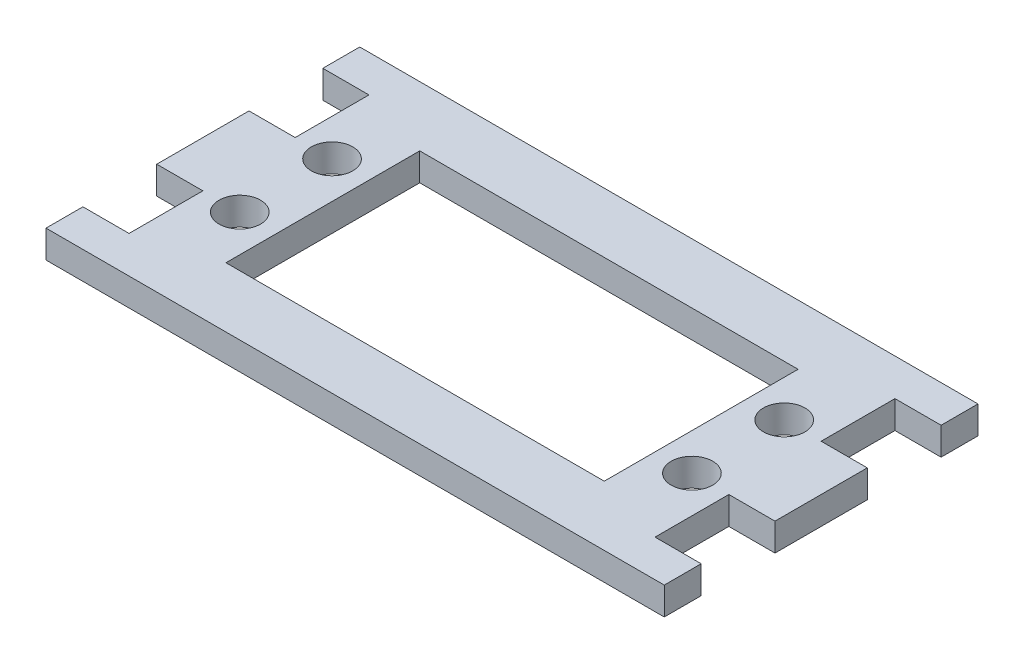
ISO-10303-21;
HEADER;
FILE_DESCRIPTION(('STEP AP214'),'2;1');
FILE_NAME('part.step','',(''),(''),'','','');
FILE_SCHEMA(('AUTOMOTIVE_DESIGN { 1 0 10303 214 1 1 1 1 }'));
ENDSEC;
DATA;
#1=APPLICATION_CONTEXT('core data for automotive mechanical design processes');
#2=APPLICATION_PROTOCOL_DEFINITION('international standard','automotive_design',2000,#1);
#3=PRODUCT_CONTEXT('',#1,'mechanical');
#4=PRODUCT('Part','Part','',(#3));
#5=PRODUCT_RELATED_PRODUCT_CATEGORY('part','',(#4));
#6=PRODUCT_DEFINITION_FORMATION('','',#4);
#7=PRODUCT_DEFINITION_CONTEXT('part definition',#1,'design');
#8=PRODUCT_DEFINITION('design','',#6,#7);
#9=PRODUCT_DEFINITION_SHAPE('','',#8);
#10=(LENGTH_UNIT() NAMED_UNIT(*) SI_UNIT(.MILLI.,.METRE.));
#11=(NAMED_UNIT(*) PLANE_ANGLE_UNIT() SI_UNIT($,.RADIAN.));
#12=(NAMED_UNIT(*) SI_UNIT($,.STERADIAN.) SOLID_ANGLE_UNIT());
#13=UNCERTAINTY_MEASURE_WITH_UNIT(LENGTH_MEASURE(1.E-05),#10,'distance_accuracy_value','');
#14=(GEOMETRIC_REPRESENTATION_CONTEXT(3) GLOBAL_UNCERTAINTY_ASSIGNED_CONTEXT((#13)) GLOBAL_UNIT_ASSIGNED_CONTEXT((#10,
#11,#12)) REPRESENTATION_CONTEXT('',''));
#15=CARTESIAN_POINT('',(0.,0.,0.));
#16=DIRECTION('',(0.,0.,1.));
#17=DIRECTION('',(1.,0.,0.));
#18=AXIS2_PLACEMENT_3D('',#15,#16,#17);
#19=CARTESIAN_POINT('',(0.,0.,0.));
#20=DIRECTION('',(0.,1.,0.));
#21=DIRECTION('',(0.,0.,1.));
#22=AXIS2_PLACEMENT_3D('',#19,#20,#21);
#23=PLANE('',#22);
#24=CARTESIAN_POINT('',(24.5,0.,-4.99999999999999));
#25=DIRECTION('',(0.,-1.,0.));
#26=DIRECTION('',(0.,0.,-1.));
#27=AXIS2_PLACEMENT_3D('',#24,#25,#26);
#28=CIRCLE('',#27,2.25);
#29=CARTESIAN_POINT('',(24.5,0.,-7.24999999999999));
#30=VERTEX_POINT('',#29);
#31=EDGE_CURVE('E214',#30,#30,#28,.F.);
#32=ORIENTED_EDGE('',*,*,#31,.T.);
#33=EDGE_LOOP('',(#32));
#34=FACE_BOUND('',#33,.T.);
#35=CARTESIAN_POINT('',(-24.5,0.,5.00000000000001));
#36=DIRECTION('',(0.,-1.,0.));
#37=DIRECTION('',(0.,0.,-1.));
#38=AXIS2_PLACEMENT_3D('',#35,#36,#37);
#39=CIRCLE('',#38,2.25);
#40=CARTESIAN_POINT('',(-24.5,0.,2.75000000000001));
#41=VERTEX_POINT('',#40);
#42=EDGE_CURVE('E217',#41,#41,#39,.F.);
#43=ORIENTED_EDGE('',*,*,#42,.T.);
#44=EDGE_LOOP('',(#43));
#45=FACE_BOUND('',#44,.T.);
#46=DIRECTION('',(1.,0.,0.));
#47=VECTOR('',#46,1.);
#48=CARTESIAN_POINT('',(-20.5,0.,-10.5));
#49=LINE('',#48,#47);
#50=CARTESIAN_POINT('',(-20.5,0.,-10.5));
#51=VERTEX_POINT('',#50);
#52=CARTESIAN_POINT('',(20.5,0.,-10.5));
#53=VERTEX_POINT('',#52);
#54=EDGE_CURVE('E574',#51,#53,#49,.T.);
#55=ORIENTED_EDGE('',*,*,#54,.F.);
#56=DIRECTION('',(0.,0.,-1.));
#57=VECTOR('',#56,1.);
#58=CARTESIAN_POINT('',(-20.5,0.,-10.5));
#59=LINE('',#58,#57);
#60=CARTESIAN_POINT('',(-20.5,0.,10.5));
#61=VERTEX_POINT('',#60);
#62=EDGE_CURVE('E560',#61,#51,#59,.T.);
#63=ORIENTED_EDGE('',*,*,#62,.F.);
#64=DIRECTION('',(-1.,0.,0.));
#65=VECTOR('',#64,1.);
#66=CARTESIAN_POINT('',(-20.5,0.,10.5));
#67=LINE('',#66,#65);
#68=CARTESIAN_POINT('',(20.5,0.,10.5));
#69=VERTEX_POINT('',#68);
#70=EDGE_CURVE('E566',#69,#61,#67,.T.);
#71=ORIENTED_EDGE('',*,*,#70,.F.);
#72=DIRECTION('',(0.,0.,1.));
#73=VECTOR('',#72,1.);
#74=CARTESIAN_POINT('',(20.5,0.,-10.5));
#75=LINE('',#74,#73);
#76=EDGE_CURVE('E571',#53,#69,#75,.T.);
#77=ORIENTED_EDGE('',*,*,#76,.F.);
#78=EDGE_LOOP('',(#55,#63,#71,#77));
#79=FACE_BOUND('',#78,.T.);
#80=DIRECTION('',(-1.,0.,0.));
#81=VECTOR('',#80,1.);
#82=CARTESIAN_POINT('',(-27.,0.,17.));
#83=LINE('',#82,#81);
#84=CARTESIAN_POINT('',(33.5,0.,17.));
#85=VERTEX_POINT('',#84);
#86=CARTESIAN_POINT('',(-33.5,0.,17.));
#87=VERTEX_POINT('',#86);
#88=EDGE_CURVE('E180',#85,#87,#83,.T.);
#89=ORIENTED_EDGE('',*,*,#88,.T.);
#90=DIRECTION('',(0.,0.,-1.));
#91=VECTOR('',#90,1.);
#92=CARTESIAN_POINT('',(-33.5,0.,17.));
#93=LINE('',#92,#91);
#94=CARTESIAN_POINT('',(-33.5,0.,13.));
#95=VERTEX_POINT('',#94);
#96=EDGE_CURVE('E577',#87,#95,#93,.T.);
#97=ORIENTED_EDGE('',*,*,#96,.T.);
#98=DIRECTION('',(1.,0.,0.));
#99=VECTOR('',#98,1.);
#100=CARTESIAN_POINT('',(-33.5,0.,13.));
#101=LINE('',#100,#99);
#102=CARTESIAN_POINT('',(-28.5,0.,13.));
#103=VERTEX_POINT('',#102);
#104=EDGE_CURVE('E582',#95,#103,#101,.T.);
#105=ORIENTED_EDGE('',*,*,#104,.T.);
#106=DIRECTION('',(0.,0.,-1.));
#107=VECTOR('',#106,1.);
#108=CARTESIAN_POINT('',(-28.5,0.,5.));
#109=LINE('',#108,#107);
#110=CARTESIAN_POINT('',(-28.5,0.,5.));
#111=VERTEX_POINT('',#110);
#112=EDGE_CURVE('E587',#103,#111,#109,.T.);
#113=ORIENTED_EDGE('',*,*,#112,.T.);
#114=DIRECTION('',(-1.,0.,0.));
#115=VECTOR('',#114,1.);
#116=CARTESIAN_POINT('',(-33.5,0.,5.));
#117=LINE('',#116,#115);
#118=CARTESIAN_POINT('',(-33.5,0.,5.));
#119=VERTEX_POINT('',#118);
#120=EDGE_CURVE('E592',#111,#119,#117,.T.);
#121=ORIENTED_EDGE('',*,*,#120,.T.);
#122=DIRECTION('',(0.,0.,-1.));
#123=VECTOR('',#122,1.);
#124=CARTESIAN_POINT('',(-33.5,0.,0.));
#125=LINE('',#124,#123);
#126=CARTESIAN_POINT('',(-33.5,0.,-5.));
#127=VERTEX_POINT('',#126);
#128=EDGE_CURVE('E597',#119,#127,#125,.T.);
#129=ORIENTED_EDGE('',*,*,#128,.T.);
#130=DIRECTION('',(1.,0.,0.));
#131=VECTOR('',#130,1.);
#132=CARTESIAN_POINT('',(-33.5,0.,-5.));
#133=LINE('',#132,#131);
#134=CARTESIAN_POINT('',(-28.5,0.,-5.));
#135=VERTEX_POINT('',#134);
#136=EDGE_CURVE('E602',#127,#135,#133,.T.);
#137=ORIENTED_EDGE('',*,*,#136,.T.);
#138=DIRECTION('',(0.,0.,-1.));
#139=VECTOR('',#138,1.);
#140=CARTESIAN_POINT('',(-28.5,0.,-5.));
#141=LINE('',#140,#139);
#142=CARTESIAN_POINT('',(-28.5,0.,-13.));
#143=VERTEX_POINT('',#142);
#144=EDGE_CURVE('E607',#135,#143,#141,.T.);
#145=ORIENTED_EDGE('',*,*,#144,.T.);
#146=DIRECTION('',(-1.,0.,0.));
#147=VECTOR('',#146,1.);
#148=CARTESIAN_POINT('',(-33.5,0.,-13.));
#149=LINE('',#148,#147);
#150=CARTESIAN_POINT('',(-33.5,0.,-13.));
#151=VERTEX_POINT('',#150);
#152=EDGE_CURVE('E612',#143,#151,#149,.T.);
#153=ORIENTED_EDGE('',*,*,#152,.T.);
#154=DIRECTION('',(0.,0.,-1.));
#155=VECTOR('',#154,1.);
#156=CARTESIAN_POINT('',(-33.5,0.,-17.));
#157=LINE('',#156,#155);
#158=CARTESIAN_POINT('',(-33.5,0.,-17.));
#159=VERTEX_POINT('',#158);
#160=EDGE_CURVE('E617',#151,#159,#157,.T.);
#161=ORIENTED_EDGE('',*,*,#160,.T.);
#162=DIRECTION('',(1.,0.,0.));
#163=VECTOR('',#162,1.);
#164=CARTESIAN_POINT('',(-28.5,0.,-17.));
#165=LINE('',#164,#163);
#166=CARTESIAN_POINT('',(33.5,0.,-17.));
#167=VERTEX_POINT('',#166);
#168=EDGE_CURVE('E622',#159,#167,#165,.T.);
#169=ORIENTED_EDGE('',*,*,#168,.T.);
#170=DIRECTION('',(0.,0.,1.));
#171=VECTOR('',#170,1.);
#172=CARTESIAN_POINT('',(33.5,0.,-17.));
#173=LINE('',#172,#171);
#174=CARTESIAN_POINT('',(33.5,0.,-13.));
#175=VERTEX_POINT('',#174);
#176=EDGE_CURVE('E627',#167,#175,#173,.T.);
#177=ORIENTED_EDGE('',*,*,#176,.T.);
#178=DIRECTION('',(-1.,0.,0.));
#179=VECTOR('',#178,1.);
#180=CARTESIAN_POINT('',(33.5,0.,-13.));
#181=LINE('',#180,#179);
#182=CARTESIAN_POINT('',(28.5,0.,-13.));
#183=VERTEX_POINT('',#182);
#184=EDGE_CURVE('E632',#175,#183,#181,.T.);
#185=ORIENTED_EDGE('',*,*,#184,.T.);
#186=DIRECTION('',(0.,0.,1.));
#187=VECTOR('',#186,1.);
#188=CARTESIAN_POINT('',(28.5,0.,-5.));
#189=LINE('',#188,#187);
#190=CARTESIAN_POINT('',(28.5,0.,-5.));
#191=VERTEX_POINT('',#190);
#192=EDGE_CURVE('E637',#183,#191,#189,.T.);
#193=ORIENTED_EDGE('',*,*,#192,.T.);
#194=DIRECTION('',(1.,0.,0.));
#195=VECTOR('',#194,1.);
#196=CARTESIAN_POINT('',(33.5,0.,-5.));
#197=LINE('',#196,#195);
#198=CARTESIAN_POINT('',(33.5,0.,-5.));
#199=VERTEX_POINT('',#198);
#200=EDGE_CURVE('E642',#191,#199,#197,.T.);
#201=ORIENTED_EDGE('',*,*,#200,.T.);
#202=DIRECTION('',(0.,0.,1.));
#203=VECTOR('',#202,1.);
#204=CARTESIAN_POINT('',(33.5,0.,0.));
#205=LINE('',#204,#203);
#206=CARTESIAN_POINT('',(33.5,0.,5.));
#207=VERTEX_POINT('',#206);
#208=EDGE_CURVE('E647',#199,#207,#205,.T.);
#209=ORIENTED_EDGE('',*,*,#208,.T.);
#210=DIRECTION('',(-1.,0.,0.));
#211=VECTOR('',#210,1.);
#212=CARTESIAN_POINT('',(33.5,0.,5.));
#213=LINE('',#212,#211);
#214=CARTESIAN_POINT('',(28.5,0.,5.));
#215=VERTEX_POINT('',#214);
#216=EDGE_CURVE('E652',#207,#215,#213,.T.);
#217=ORIENTED_EDGE('',*,*,#216,.T.);
#218=DIRECTION('',(0.,0.,1.));
#219=VECTOR('',#218,1.);
#220=CARTESIAN_POINT('',(28.5,0.,5.));
#221=LINE('',#220,#219);
#222=CARTESIAN_POINT('',(28.5,0.,13.));
#223=VERTEX_POINT('',#222);
#224=EDGE_CURVE('E538',#215,#223,#221,.T.);
#225=ORIENTED_EDGE('',*,*,#224,.T.);
#226=DIRECTION('',(1.,0.,0.));
#227=VECTOR('',#226,1.);
#228=CARTESIAN_POINT('',(33.5,0.,13.));
#229=LINE('',#228,#227);
#230=CARTESIAN_POINT('',(33.5,0.,13.));
#231=VERTEX_POINT('',#230);
#232=EDGE_CURVE('E193',#223,#231,#229,.T.);
#233=ORIENTED_EDGE('',*,*,#232,.T.);
#234=DIRECTION('',(0.,0.,1.));
#235=VECTOR('',#234,1.);
#236=CARTESIAN_POINT('',(33.5,0.,17.));
#237=LINE('',#236,#235);
#238=EDGE_CURVE('E175',#231,#85,#237,.T.);
#239=ORIENTED_EDGE('',*,*,#238,.T.);
#240=EDGE_LOOP('',(#89,#97,#105,#113,#121,#129,#137,#145,#153,#161,#169,#177,#185,#193,#201,
#209,#217,#225,#233,#239));
#241=FACE_BOUND('',#240,.T.);
#242=CARTESIAN_POINT('',(-24.5,0.,-4.99999999999999));
#243=DIRECTION('',(0.,-1.,0.));
#244=DIRECTION('',(0.,0.,-1.));
#245=AXIS2_PLACEMENT_3D('',#242,#243,#244);
#246=CIRCLE('',#245,2.25);
#247=CARTESIAN_POINT('',(-24.5,0.,-7.24999999999999));
#248=VERTEX_POINT('',#247);
#249=EDGE_CURVE('E189',#248,#248,#246,.F.);
#250=ORIENTED_EDGE('',*,*,#249,.T.);
#251=EDGE_LOOP('',(#250));
#252=FACE_BOUND('',#251,.T.);
#253=CARTESIAN_POINT('',(24.5,0.,5.00000000000001));
#254=DIRECTION('',(0.,-1.,0.));
#255=DIRECTION('',(0.,0.,-1.));
#256=AXIS2_PLACEMENT_3D('',#253,#254,#255);
#257=CIRCLE('',#256,2.25);
#258=CARTESIAN_POINT('',(24.5,0.,2.75000000000001));
#259=VERTEX_POINT('',#258);
#260=EDGE_CURVE('E19',#259,#259,#257,.F.);
#261=ORIENTED_EDGE('',*,*,#260,.T.);
#262=EDGE_LOOP('',(#261));
#263=FACE_BOUND('',#262,.T.);
#264=ADVANCED_FACE('F16',(#34,#45,#79,#241,#252,#263),#23,.F.);
#265=CARTESIAN_POINT('',(24.5,3.,5.00000000000001));
#266=DIRECTION('',(0.,-1.,0.));
#267=DIRECTION('',(0.,0.,-1.));
#268=AXIS2_PLACEMENT_3D('',#265,#266,#267);
#269=CYLINDRICAL_SURFACE('',#268,2.25);
#270=CARTESIAN_POINT('',(24.5,3.,5.00000000000001));
#271=DIRECTION('',(0.,-1.,0.));
#272=DIRECTION('',(0.,0.,-1.));
#273=AXIS2_PLACEMENT_3D('',#270,#271,#272);
#274=CIRCLE('',#273,2.25);
#275=CARTESIAN_POINT('',(24.5,3.,2.75000000000001));
#276=VERTEX_POINT('',#275);
#277=EDGE_CURVE('E211',#276,#276,#274,.T.);
#278=ORIENTED_EDGE('',*,*,#277,.F.);
#279=EDGE_LOOP('',(#278));
#280=FACE_BOUND('',#279,.T.);
#281=ORIENTED_EDGE('',*,*,#260,.F.);
#282=EDGE_LOOP('',(#281));
#283=FACE_BOUND('',#282,.T.);
#284=ADVANCED_FACE('F225',(#280,#283),#269,.F.);
#285=CARTESIAN_POINT('',(-24.5,3.,-4.99999999999999));
#286=DIRECTION('',(0.,-1.,0.));
#287=DIRECTION('',(0.,0.,-1.));
#288=AXIS2_PLACEMENT_3D('',#285,#286,#287);
#289=CYLINDRICAL_SURFACE('',#288,2.25);
#290=CARTESIAN_POINT('',(-24.5,3.,-4.99999999999999));
#291=DIRECTION('',(0.,-1.,0.));
#292=DIRECTION('',(0.,0.,-1.));
#293=AXIS2_PLACEMENT_3D('',#290,#291,#292);
#294=CIRCLE('',#293,2.25);
#295=CARTESIAN_POINT('',(-24.5,3.,-7.24999999999999));
#296=VERTEX_POINT('',#295);
#297=EDGE_CURVE('E207',#296,#296,#294,.T.);
#298=ORIENTED_EDGE('',*,*,#297,.F.);
#299=EDGE_LOOP('',(#298));
#300=FACE_BOUND('',#299,.T.);
#301=ORIENTED_EDGE('',*,*,#249,.F.);
#302=EDGE_LOOP('',(#301));
#303=FACE_BOUND('',#302,.T.);
#304=ADVANCED_FACE('F227',(#300,#303),#289,.F.);
#305=CARTESIAN_POINT('',(-27.,3.,17.));
#306=DIRECTION('',(0.,0.,-1.));
#307=DIRECTION('',(-1.,0.,0.));
#308=AXIS2_PLACEMENT_3D('',#305,#306,#307);
#309=PLANE('',#308);
#310=DIRECTION('',(0.,1.,0.));
#311=VECTOR('',#310,1.);
#312=CARTESIAN_POINT('',(33.5,3.,17.));
#313=LINE('',#312,#311);
#314=CARTESIAN_POINT('',(33.5,3.,17.));
#315=VERTEX_POINT('',#314);
#316=EDGE_CURVE('E182',#85,#315,#313,.T.);
#317=ORIENTED_EDGE('',*,*,#316,.T.);
#318=DIRECTION('',(1.,0.,0.));
#319=VECTOR('',#318,1.);
#320=CARTESIAN_POINT('',(0.,3.,17.));
#321=LINE('',#320,#319);
#322=CARTESIAN_POINT('',(-33.5,3.,17.));
#323=VERTEX_POINT('',#322);
#324=EDGE_CURVE('E210',#323,#315,#321,.T.);
#325=ORIENTED_EDGE('',*,*,#324,.F.);
#326=DIRECTION('',(0.,1.,0.));
#327=VECTOR('',#326,1.);
#328=CARTESIAN_POINT('',(-33.5,3.,17.));
#329=LINE('',#328,#327);
#330=EDGE_CURVE('E185',#323,#87,#329,.F.);
#331=ORIENTED_EDGE('',*,*,#330,.T.);
#332=ORIENTED_EDGE('',*,*,#88,.F.);
#333=EDGE_LOOP('',(#317,#325,#331,#332));
#334=FACE_BOUND('',#333,.T.);
#335=ADVANCED_FACE('F181',(#334),#309,.F.);
#336=CARTESIAN_POINT('',(33.5,3.,17.));
#337=DIRECTION('',(-1.,0.,0.));
#338=DIRECTION('',(0.,0.,1.));
#339=AXIS2_PLACEMENT_3D('',#336,#337,#338);
#340=PLANE('',#339);
#341=DIRECTION('',(0.,1.,0.));
#342=VECTOR('',#341,1.);
#343=CARTESIAN_POINT('',(33.5,3.,13.));
#344=LINE('',#343,#342);
#345=CARTESIAN_POINT('',(33.5,3.,13.));
#346=VERTEX_POINT('',#345);
#347=EDGE_CURVE('E195',#231,#346,#344,.T.);
#348=ORIENTED_EDGE('',*,*,#347,.T.);
#349=DIRECTION('',(0.,0.,1.));
#350=VECTOR('',#349,1.);
#351=CARTESIAN_POINT('',(33.5,3.,0.));
#352=LINE('',#351,#350);
#353=EDGE_CURVE('E199',#315,#346,#352,.F.);
#354=ORIENTED_EDGE('',*,*,#353,.F.);
#355=ORIENTED_EDGE('',*,*,#316,.F.);
#356=ORIENTED_EDGE('',*,*,#238,.F.);
#357=EDGE_LOOP('',(#348,#354,#355,#356));
#358=FACE_BOUND('',#357,.T.);
#359=ADVANCED_FACE('F197',(#358),#340,.F.);
#360=CARTESIAN_POINT('',(33.5,3.,13.));
#361=DIRECTION('',(0.,0.,1.));
#362=DIRECTION('',(1.,0.,0.));
#363=AXIS2_PLACEMENT_3D('',#360,#361,#362);
#364=PLANE('',#363);
#365=DIRECTION('',(0.,1.,0.));
#366=VECTOR('',#365,1.);
#367=CARTESIAN_POINT('',(28.5,3.,13.));
#368=LINE('',#367,#366);
#369=CARTESIAN_POINT('',(28.5,3.,13.));
#370=VERTEX_POINT('',#369);
#371=EDGE_CURVE('E534',#223,#370,#368,.T.);
#372=ORIENTED_EDGE('',*,*,#371,.T.);
#373=DIRECTION('',(1.,0.,0.));
#374=VECTOR('',#373,1.);
#375=CARTESIAN_POINT('',(0.,3.,13.));
#376=LINE('',#375,#374);
#377=EDGE_CURVE('E537',#346,#370,#376,.F.);
#378=ORIENTED_EDGE('',*,*,#377,.F.);
#379=ORIENTED_EDGE('',*,*,#347,.F.);
#380=ORIENTED_EDGE('',*,*,#232,.F.);
#381=EDGE_LOOP('',(#372,#378,#379,#380));
#382=FACE_BOUND('',#381,.T.);
#383=ADVANCED_FACE('F336',(#382),#364,.F.);
#384=CARTESIAN_POINT('',(28.5,3.,5.));
#385=DIRECTION('',(-1.,0.,0.));
#386=DIRECTION('',(0.,0.,1.));
#387=AXIS2_PLACEMENT_3D('',#384,#385,#386);
#388=PLANE('',#387);
#389=DIRECTION('',(0.,1.,0.));
#390=VECTOR('',#389,1.);
#391=CARTESIAN_POINT('',(28.5,3.,5.));
#392=LINE('',#391,#390);
#393=CARTESIAN_POINT('',(28.5,3.,5.));
#394=VERTEX_POINT('',#393);
#395=EDGE_CURVE('E543',#215,#394,#392,.T.);
#396=ORIENTED_EDGE('',*,*,#395,.T.);
#397=DIRECTION('',(0.,0.,1.));
#398=VECTOR('',#397,1.);
#399=CARTESIAN_POINT('',(28.5,3.,0.));
#400=LINE('',#399,#398);
#401=EDGE_CURVE('E541',#370,#394,#400,.F.);
#402=ORIENTED_EDGE('',*,*,#401,.F.);
#403=ORIENTED_EDGE('',*,*,#371,.F.);
#404=ORIENTED_EDGE('',*,*,#224,.F.);
#405=EDGE_LOOP('',(#396,#402,#403,#404));
#406=FACE_BOUND('',#405,.T.);
#407=ADVANCED_FACE('F332',(#406),#388,.F.);
#408=CARTESIAN_POINT('',(33.5,3.,5.));
#409=DIRECTION('',(0.,0.,-1.));
#410=DIRECTION('',(-1.,0.,0.));
#411=AXIS2_PLACEMENT_3D('',#408,#409,#410);
#412=PLANE('',#411);
#413=DIRECTION('',(0.,1.,0.));
#414=VECTOR('',#413,1.);
#415=CARTESIAN_POINT('',(33.5,3.,5.));
#416=LINE('',#415,#414);
#417=CARTESIAN_POINT('',(33.5,3.,5.));
#418=VERTEX_POINT('',#417);
#419=EDGE_CURVE('E650',#207,#418,#416,.T.);
#420=ORIENTED_EDGE('',*,*,#419,.T.);
#421=DIRECTION('',(1.,0.,0.));
#422=VECTOR('',#421,1.);
#423=CARTESIAN_POINT('',(0.,3.,5.));
#424=LINE('',#423,#422);
#425=EDGE_CURVE('E547',#394,#418,#424,.T.);
#426=ORIENTED_EDGE('',*,*,#425,.F.);
#427=ORIENTED_EDGE('',*,*,#395,.F.);
#428=ORIENTED_EDGE('',*,*,#216,.F.);
#429=EDGE_LOOP('',(#420,#426,#427,#428));
#430=FACE_BOUND('',#429,.T.);
#431=ADVANCED_FACE('F328',(#430),#412,.F.);
#432=CARTESIAN_POINT('',(33.5,3.,0.));
#433=DIRECTION('',(-1.,0.,0.));
#434=DIRECTION('',(0.,0.,1.));
#435=AXIS2_PLACEMENT_3D('',#432,#433,#434);
#436=PLANE('',#435);
#437=DIRECTION('',(0.,1.,0.));
#438=VECTOR('',#437,1.);
#439=CARTESIAN_POINT('',(33.5,3.,-5.));
#440=LINE('',#439,#438);
#441=CARTESIAN_POINT('',(33.5,3.,-5.));
#442=VERTEX_POINT('',#441);
#443=EDGE_CURVE('E645',#199,#442,#440,.T.);
#444=ORIENTED_EDGE('',*,*,#443,.T.);
#445=DIRECTION('',(0.,0.,1.));
#446=VECTOR('',#445,1.);
#447=CARTESIAN_POINT('',(33.5,3.,0.));
#448=LINE('',#447,#446);
#449=EDGE_CURVE('E660',#418,#442,#448,.F.);
#450=ORIENTED_EDGE('',*,*,#449,.F.);
#451=ORIENTED_EDGE('',*,*,#419,.F.);
#452=ORIENTED_EDGE('',*,*,#208,.F.);
#453=EDGE_LOOP('',(#444,#450,#451,#452));
#454=FACE_BOUND('',#453,.T.);
#455=ADVANCED_FACE('F324',(#454),#436,.F.);
#456=CARTESIAN_POINT('',(33.5,3.,-5.));
#457=DIRECTION('',(0.,0.,1.));
#458=DIRECTION('',(1.,0.,0.));
#459=AXIS2_PLACEMENT_3D('',#456,#457,#458);
#460=PLANE('',#459);
#461=DIRECTION('',(0.,1.,0.));
#462=VECTOR('',#461,1.);
#463=CARTESIAN_POINT('',(28.5,3.,-5.));
#464=LINE('',#463,#462);
#465=CARTESIAN_POINT('',(28.5,3.,-5.));
#466=VERTEX_POINT('',#465);
#467=EDGE_CURVE('E640',#191,#466,#464,.T.);
#468=ORIENTED_EDGE('',*,*,#467,.T.);
#469=DIRECTION('',(1.,0.,0.));
#470=VECTOR('',#469,1.);
#471=CARTESIAN_POINT('',(0.,3.,-5.));
#472=LINE('',#471,#470);
#473=EDGE_CURVE('E661',#442,#466,#472,.F.);
#474=ORIENTED_EDGE('',*,*,#473,.F.);
#475=ORIENTED_EDGE('',*,*,#443,.F.);
#476=ORIENTED_EDGE('',*,*,#200,.F.);
#477=EDGE_LOOP('',(#468,#474,#475,#476));
#478=FACE_BOUND('',#477,.T.);
#479=ADVANCED_FACE('F320',(#478),#460,.F.);
#480=CARTESIAN_POINT('',(28.5,3.,-5.));
#481=DIRECTION('',(-1.,0.,0.));
#482=DIRECTION('',(0.,0.,1.));
#483=AXIS2_PLACEMENT_3D('',#480,#481,#482);
#484=PLANE('',#483);
#485=DIRECTION('',(0.,1.,0.));
#486=VECTOR('',#485,1.);
#487=CARTESIAN_POINT('',(28.5,3.,-13.));
#488=LINE('',#487,#486);
#489=CARTESIAN_POINT('',(28.5,3.,-13.));
#490=VERTEX_POINT('',#489);
#491=EDGE_CURVE('E635',#183,#490,#488,.T.);
#492=ORIENTED_EDGE('',*,*,#491,.T.);
#493=DIRECTION('',(0.,0.,1.));
#494=VECTOR('',#493,1.);
#495=CARTESIAN_POINT('',(28.5,3.,0.));
#496=LINE('',#495,#494);
#497=EDGE_CURVE('E666',#466,#490,#496,.F.);
#498=ORIENTED_EDGE('',*,*,#497,.F.);
#499=ORIENTED_EDGE('',*,*,#467,.F.);
#500=ORIENTED_EDGE('',*,*,#192,.F.);
#501=EDGE_LOOP('',(#492,#498,#499,#500));
#502=FACE_BOUND('',#501,.T.);
#503=ADVANCED_FACE('F316',(#502),#484,.F.);
#504=CARTESIAN_POINT('',(33.5,3.,-13.));
#505=DIRECTION('',(0.,0.,-1.));
#506=DIRECTION('',(-1.,0.,0.));
#507=AXIS2_PLACEMENT_3D('',#504,#505,#506);
#508=PLANE('',#507);
#509=DIRECTION('',(0.,1.,0.));
#510=VECTOR('',#509,1.);
#511=CARTESIAN_POINT('',(33.5,3.,-13.));
#512=LINE('',#511,#510);
#513=CARTESIAN_POINT('',(33.5,3.,-13.));
#514=VERTEX_POINT('',#513);
#515=EDGE_CURVE('E630',#175,#514,#512,.T.);
#516=ORIENTED_EDGE('',*,*,#515,.T.);
#517=DIRECTION('',(1.,0.,0.));
#518=VECTOR('',#517,1.);
#519=CARTESIAN_POINT('',(0.,3.,-13.));
#520=LINE('',#519,#518);
#521=EDGE_CURVE('E669',#490,#514,#520,.T.);
#522=ORIENTED_EDGE('',*,*,#521,.F.);
#523=ORIENTED_EDGE('',*,*,#491,.F.);
#524=ORIENTED_EDGE('',*,*,#184,.F.);
#525=EDGE_LOOP('',(#516,#522,#523,#524));
#526=FACE_BOUND('',#525,.T.);
#527=ADVANCED_FACE('F312',(#526),#508,.F.);
#528=CARTESIAN_POINT('',(33.5,3.,-17.));
#529=DIRECTION('',(-1.,0.,0.));
#530=DIRECTION('',(0.,0.,1.));
#531=AXIS2_PLACEMENT_3D('',#528,#529,#530);
#532=PLANE('',#531);
#533=DIRECTION('',(0.,1.,0.));
#534=VECTOR('',#533,1.);
#535=CARTESIAN_POINT('',(33.5,3.,-17.));
#536=LINE('',#535,#534);
#537=CARTESIAN_POINT('',(33.5,3.,-17.));
#538=VERTEX_POINT('',#537);
#539=EDGE_CURVE('E625',#167,#538,#536,.T.);
#540=ORIENTED_EDGE('',*,*,#539,.T.);
#541=DIRECTION('',(0.,0.,1.));
#542=VECTOR('',#541,1.);
#543=CARTESIAN_POINT('',(33.5,3.,0.));
#544=LINE('',#543,#542);
#545=EDGE_CURVE('E672',#514,#538,#544,.F.);
#546=ORIENTED_EDGE('',*,*,#545,.F.);
#547=ORIENTED_EDGE('',*,*,#515,.F.);
#548=ORIENTED_EDGE('',*,*,#176,.F.);
#549=EDGE_LOOP('',(#540,#546,#547,#548));
#550=FACE_BOUND('',#549,.T.);
#551=ADVANCED_FACE('F308',(#550),#532,.F.);
#552=CARTESIAN_POINT('',(-28.5,3.,-17.));
#553=DIRECTION('',(0.,0.,1.));
#554=DIRECTION('',(1.,0.,0.));
#555=AXIS2_PLACEMENT_3D('',#552,#553,#554);
#556=PLANE('',#555);
#557=DIRECTION('',(0.,1.,0.));
#558=VECTOR('',#557,1.);
#559=CARTESIAN_POINT('',(-33.5,3.,-17.));
#560=LINE('',#559,#558);
#561=CARTESIAN_POINT('',(-33.5,3.,-17.));
#562=VERTEX_POINT('',#561);
#563=EDGE_CURVE('E620',#159,#562,#560,.T.);
#564=ORIENTED_EDGE('',*,*,#563,.T.);
#565=DIRECTION('',(1.,0.,0.));
#566=VECTOR('',#565,1.);
#567=CARTESIAN_POINT('',(0.,3.,-17.));
#568=LINE('',#567,#566);
#569=EDGE_CURVE('E675',#538,#562,#568,.F.);
#570=ORIENTED_EDGE('',*,*,#569,.F.);
#571=ORIENTED_EDGE('',*,*,#539,.F.);
#572=ORIENTED_EDGE('',*,*,#168,.F.);
#573=EDGE_LOOP('',(#564,#570,#571,#572));
#574=FACE_BOUND('',#573,.T.);
#575=ADVANCED_FACE('F304',(#574),#556,.F.);
#576=CARTESIAN_POINT('',(-33.5,3.,-17.));
#577=DIRECTION('',(1.,0.,0.));
#578=DIRECTION('',(0.,0.,-1.));
#579=AXIS2_PLACEMENT_3D('',#576,#577,#578);
#580=PLANE('',#579);
#581=DIRECTION('',(0.,1.,0.));
#582=VECTOR('',#581,1.);
#583=CARTESIAN_POINT('',(-33.5,3.,-13.));
#584=LINE('',#583,#582);
#585=CARTESIAN_POINT('',(-33.5,3.,-13.));
#586=VERTEX_POINT('',#585);
#587=EDGE_CURVE('E615',#151,#586,#584,.T.);
#588=ORIENTED_EDGE('',*,*,#587,.T.);
#589=DIRECTION('',(0.,0.,1.));
#590=VECTOR('',#589,1.);
#591=CARTESIAN_POINT('',(-33.5,3.,0.));
#592=LINE('',#591,#590);
#593=EDGE_CURVE('E678',#562,#586,#592,.T.);
#594=ORIENTED_EDGE('',*,*,#593,.F.);
#595=ORIENTED_EDGE('',*,*,#563,.F.);
#596=ORIENTED_EDGE('',*,*,#160,.F.);
#597=EDGE_LOOP('',(#588,#594,#595,#596));
#598=FACE_BOUND('',#597,.T.);
#599=ADVANCED_FACE('F300',(#598),#580,.F.);
#600=CARTESIAN_POINT('',(-33.5,3.,-13.));
#601=DIRECTION('',(0.,0.,-1.));
#602=DIRECTION('',(-1.,0.,0.));
#603=AXIS2_PLACEMENT_3D('',#600,#601,#602);
#604=PLANE('',#603);
#605=DIRECTION('',(0.,1.,0.));
#606=VECTOR('',#605,1.);
#607=CARTESIAN_POINT('',(-28.5,3.,-13.));
#608=LINE('',#607,#606);
#609=CARTESIAN_POINT('',(-28.5,3.,-13.));
#610=VERTEX_POINT('',#609);
#611=EDGE_CURVE('E610',#143,#610,#608,.T.);
#612=ORIENTED_EDGE('',*,*,#611,.T.);
#613=DIRECTION('',(1.,0.,0.));
#614=VECTOR('',#613,1.);
#615=CARTESIAN_POINT('',(0.,3.,-13.));
#616=LINE('',#615,#614);
#617=EDGE_CURVE('E681',#586,#610,#616,.T.);
#618=ORIENTED_EDGE('',*,*,#617,.F.);
#619=ORIENTED_EDGE('',*,*,#587,.F.);
#620=ORIENTED_EDGE('',*,*,#152,.F.);
#621=EDGE_LOOP('',(#612,#618,#619,#620));
#622=FACE_BOUND('',#621,.T.);
#623=ADVANCED_FACE('F296',(#622),#604,.F.);
#624=CARTESIAN_POINT('',(-28.5,3.,-5.));
#625=DIRECTION('',(1.,0.,0.));
#626=DIRECTION('',(0.,0.,-1.));
#627=AXIS2_PLACEMENT_3D('',#624,#625,#626);
#628=PLANE('',#627);
#629=DIRECTION('',(0.,1.,0.));
#630=VECTOR('',#629,1.);
#631=CARTESIAN_POINT('',(-28.5,3.,-5.));
#632=LINE('',#631,#630);
#633=CARTESIAN_POINT('',(-28.5,3.,-5.));
#634=VERTEX_POINT('',#633);
#635=EDGE_CURVE('E605',#135,#634,#632,.T.);
#636=ORIENTED_EDGE('',*,*,#635,.T.);
#637=DIRECTION('',(0.,0.,1.));
#638=VECTOR('',#637,1.);
#639=CARTESIAN_POINT('',(-28.5,3.,0.));
#640=LINE('',#639,#638);
#641=EDGE_CURVE('E684',#610,#634,#640,.T.);
#642=ORIENTED_EDGE('',*,*,#641,.F.);
#643=ORIENTED_EDGE('',*,*,#611,.F.);
#644=ORIENTED_EDGE('',*,*,#144,.F.);
#645=EDGE_LOOP('',(#636,#642,#643,#644));
#646=FACE_BOUND('',#645,.T.);
#647=ADVANCED_FACE('F292',(#646),#628,.F.);
#648=CARTESIAN_POINT('',(-33.5,3.,-5.));
#649=DIRECTION('',(0.,0.,1.));
#650=DIRECTION('',(1.,0.,0.));
#651=AXIS2_PLACEMENT_3D('',#648,#649,#650);
#652=PLANE('',#651);
#653=DIRECTION('',(0.,1.,0.));
#654=VECTOR('',#653,1.);
#655=CARTESIAN_POINT('',(-33.5,3.,-5.));
#656=LINE('',#655,#654);
#657=CARTESIAN_POINT('',(-33.5,3.,-5.));
#658=VERTEX_POINT('',#657);
#659=EDGE_CURVE('E600',#127,#658,#656,.T.);
#660=ORIENTED_EDGE('',*,*,#659,.T.);
#661=DIRECTION('',(1.,0.,0.));
#662=VECTOR('',#661,1.);
#663=CARTESIAN_POINT('',(0.,3.,-5.));
#664=LINE('',#663,#662);
#665=EDGE_CURVE('E687',#634,#658,#664,.F.);
#666=ORIENTED_EDGE('',*,*,#665,.F.);
#667=ORIENTED_EDGE('',*,*,#635,.F.);
#668=ORIENTED_EDGE('',*,*,#136,.F.);
#669=EDGE_LOOP('',(#660,#666,#667,#668));
#670=FACE_BOUND('',#669,.T.);
#671=ADVANCED_FACE('F288',(#670),#652,.F.);
#672=CARTESIAN_POINT('',(-33.5,3.,0.));
#673=DIRECTION('',(1.,0.,0.));
#674=DIRECTION('',(0.,0.,-1.));
#675=AXIS2_PLACEMENT_3D('',#672,#673,#674);
#676=PLANE('',#675);
#677=DIRECTION('',(0.,1.,0.));
#678=VECTOR('',#677,1.);
#679=CARTESIAN_POINT('',(-33.5,3.,5.));
#680=LINE('',#679,#678);
#681=CARTESIAN_POINT('',(-33.5,3.,5.));
#682=VERTEX_POINT('',#681);
#683=EDGE_CURVE('E595',#119,#682,#680,.T.);
#684=ORIENTED_EDGE('',*,*,#683,.T.);
#685=DIRECTION('',(0.,0.,1.));
#686=VECTOR('',#685,1.);
#687=CARTESIAN_POINT('',(-33.5,3.,0.));
#688=LINE('',#687,#686);
#689=EDGE_CURVE('E690',#658,#682,#688,.T.);
#690=ORIENTED_EDGE('',*,*,#689,.F.);
#691=ORIENTED_EDGE('',*,*,#659,.F.);
#692=ORIENTED_EDGE('',*,*,#128,.F.);
#693=EDGE_LOOP('',(#684,#690,#691,#692));
#694=FACE_BOUND('',#693,.T.);
#695=ADVANCED_FACE('F284',(#694),#676,.F.);
#696=CARTESIAN_POINT('',(-33.5,3.,5.));
#697=DIRECTION('',(0.,0.,-1.));
#698=DIRECTION('',(-1.,0.,0.));
#699=AXIS2_PLACEMENT_3D('',#696,#697,#698);
#700=PLANE('',#699);
#701=DIRECTION('',(0.,1.,0.));
#702=VECTOR('',#701,1.);
#703=CARTESIAN_POINT('',(-28.5,3.,5.));
#704=LINE('',#703,#702);
#705=CARTESIAN_POINT('',(-28.5,3.,5.));
#706=VERTEX_POINT('',#705);
#707=EDGE_CURVE('E590',#111,#706,#704,.T.);
#708=ORIENTED_EDGE('',*,*,#707,.T.);
#709=DIRECTION('',(1.,0.,0.));
#710=VECTOR('',#709,1.);
#711=CARTESIAN_POINT('',(0.,3.,5.));
#712=LINE('',#711,#710);
#713=EDGE_CURVE('E693',#682,#706,#712,.T.);
#714=ORIENTED_EDGE('',*,*,#713,.F.);
#715=ORIENTED_EDGE('',*,*,#683,.F.);
#716=ORIENTED_EDGE('',*,*,#120,.F.);
#717=EDGE_LOOP('',(#708,#714,#715,#716));
#718=FACE_BOUND('',#717,.T.);
#719=ADVANCED_FACE('F280',(#718),#700,.F.);
#720=CARTESIAN_POINT('',(-28.5,3.,5.));
#721=DIRECTION('',(1.,0.,0.));
#722=DIRECTION('',(0.,0.,-1.));
#723=AXIS2_PLACEMENT_3D('',#720,#721,#722);
#724=PLANE('',#723);
#725=DIRECTION('',(0.,1.,0.));
#726=VECTOR('',#725,1.);
#727=CARTESIAN_POINT('',(-28.5,3.,13.));
#728=LINE('',#727,#726);
#729=CARTESIAN_POINT('',(-28.5,3.,13.));
#730=VERTEX_POINT('',#729);
#731=EDGE_CURVE('E585',#103,#730,#728,.T.);
#732=ORIENTED_EDGE('',*,*,#731,.T.);
#733=DIRECTION('',(0.,0.,1.));
#734=VECTOR('',#733,1.);
#735=CARTESIAN_POINT('',(-28.5,3.,0.));
#736=LINE('',#735,#734);
#737=EDGE_CURVE('E696',#706,#730,#736,.T.);
#738=ORIENTED_EDGE('',*,*,#737,.F.);
#739=ORIENTED_EDGE('',*,*,#707,.F.);
#740=ORIENTED_EDGE('',*,*,#112,.F.);
#741=EDGE_LOOP('',(#732,#738,#739,#740));
#742=FACE_BOUND('',#741,.T.);
#743=ADVANCED_FACE('F276',(#742),#724,.F.);
#744=CARTESIAN_POINT('',(-33.5,3.,13.));
#745=DIRECTION('',(0.,0.,1.));
#746=DIRECTION('',(1.,0.,0.));
#747=AXIS2_PLACEMENT_3D('',#744,#745,#746);
#748=PLANE('',#747);
#749=DIRECTION('',(0.,1.,0.));
#750=VECTOR('',#749,1.);
#751=CARTESIAN_POINT('',(-33.5,3.,13.));
#752=LINE('',#751,#750);
#753=CARTESIAN_POINT('',(-33.5,3.,13.));
#754=VERTEX_POINT('',#753);
#755=EDGE_CURVE('E580',#95,#754,#752,.T.);
#756=ORIENTED_EDGE('',*,*,#755,.T.);
#757=DIRECTION('',(1.,0.,0.));
#758=VECTOR('',#757,1.);
#759=CARTESIAN_POINT('',(0.,3.,13.));
#760=LINE('',#759,#758);
#761=EDGE_CURVE('E699',#730,#754,#760,.F.);
#762=ORIENTED_EDGE('',*,*,#761,.F.);
#763=ORIENTED_EDGE('',*,*,#731,.F.);
#764=ORIENTED_EDGE('',*,*,#104,.F.);
#765=EDGE_LOOP('',(#756,#762,#763,#764));
#766=FACE_BOUND('',#765,.T.);
#767=ADVANCED_FACE('F272',(#766),#748,.F.);
#768=CARTESIAN_POINT('',(-33.5,3.,17.));
#769=DIRECTION('',(1.,0.,0.));
#770=DIRECTION('',(0.,0.,-1.));
#771=AXIS2_PLACEMENT_3D('',#768,#769,#770);
#772=PLANE('',#771);
#773=ORIENTED_EDGE('',*,*,#330,.F.);
#774=DIRECTION('',(0.,0.,1.));
#775=VECTOR('',#774,1.);
#776=CARTESIAN_POINT('',(-33.5,3.,0.));
#777=LINE('',#776,#775);
#778=EDGE_CURVE('E701',#754,#323,#777,.T.);
#779=ORIENTED_EDGE('',*,*,#778,.F.);
#780=ORIENTED_EDGE('',*,*,#755,.F.);
#781=ORIENTED_EDGE('',*,*,#96,.F.);
#782=EDGE_LOOP('',(#773,#779,#780,#781));
#783=FACE_BOUND('',#782,.T.);
#784=ADVANCED_FACE('F268',(#783),#772,.F.);
#785=CARTESIAN_POINT('',(-20.5,3.,-10.5));
#786=DIRECTION('',(0.,0.,1.));
#787=DIRECTION('',(1.,0.,0.));
#788=AXIS2_PLACEMENT_3D('',#785,#786,#787);
#789=PLANE('',#788);
#790=DIRECTION('',(1.,0.,0.));
#791=VECTOR('',#790,1.);
#792=CARTESIAN_POINT('',(0.,3.,-10.5));
#793=LINE('',#792,#791);
#794=CARTESIAN_POINT('',(-20.5,3.,-10.5));
#795=VERTEX_POINT('',#794);
#796=CARTESIAN_POINT('',(20.5,3.,-10.5));
#797=VERTEX_POINT('',#796);
#798=EDGE_CURVE('E704',#795,#797,#793,.T.);
#799=ORIENTED_EDGE('',*,*,#798,.F.);
#800=DIRECTION('',(0.,1.,0.));
#801=VECTOR('',#800,1.);
#802=CARTESIAN_POINT('',(-20.5,3.,-10.5));
#803=LINE('',#802,#801);
#804=EDGE_CURVE('E557',#51,#795,#803,.T.);
#805=ORIENTED_EDGE('',*,*,#804,.F.);
#806=ORIENTED_EDGE('',*,*,#54,.T.);
#807=DIRECTION('',(0.,1.,0.));
#808=VECTOR('',#807,1.);
#809=CARTESIAN_POINT('',(20.5,3.,-10.5));
#810=LINE('',#809,#808);
#811=EDGE_CURVE('E568',#797,#53,#810,.F.);
#812=ORIENTED_EDGE('',*,*,#811,.F.);
#813=EDGE_LOOP('',(#799,#805,#806,#812));
#814=FACE_BOUND('',#813,.T.);
#815=ADVANCED_FACE('F264',(#814),#789,.T.);
#816=CARTESIAN_POINT('',(20.5,3.,-10.5));
#817=DIRECTION('',(-1.,0.,0.));
#818=DIRECTION('',(0.,0.,1.));
#819=AXIS2_PLACEMENT_3D('',#816,#817,#818);
#820=PLANE('',#819);
#821=DIRECTION('',(0.,0.,1.));
#822=VECTOR('',#821,1.);
#823=CARTESIAN_POINT('',(20.5,3.,0.));
#824=LINE('',#823,#822);
#825=CARTESIAN_POINT('',(20.5,3.,10.5));
#826=VERTEX_POINT('',#825);
#827=EDGE_CURVE('E707',#797,#826,#824,.T.);
#828=ORIENTED_EDGE('',*,*,#827,.F.);
#829=ORIENTED_EDGE('',*,*,#811,.T.);
#830=ORIENTED_EDGE('',*,*,#76,.T.);
#831=DIRECTION('',(0.,1.,0.));
#832=VECTOR('',#831,1.);
#833=CARTESIAN_POINT('',(20.5,3.,10.5));
#834=LINE('',#833,#832);
#835=EDGE_CURVE('E563',#826,#69,#834,.F.);
#836=ORIENTED_EDGE('',*,*,#835,.F.);
#837=EDGE_LOOP('',(#828,#829,#830,#836));
#838=FACE_BOUND('',#837,.T.);
#839=ADVANCED_FACE('F261',(#838),#820,.T.);
#840=CARTESIAN_POINT('',(-20.5,3.,10.5));
#841=DIRECTION('',(0.,0.,-1.));
#842=DIRECTION('',(-1.,0.,0.));
#843=AXIS2_PLACEMENT_3D('',#840,#841,#842);
#844=PLANE('',#843);
#845=DIRECTION('',(1.,0.,0.));
#846=VECTOR('',#845,1.);
#847=CARTESIAN_POINT('',(0.,3.,10.5));
#848=LINE('',#847,#846);
#849=CARTESIAN_POINT('',(-20.5,3.,10.5));
#850=VERTEX_POINT('',#849);
#851=EDGE_CURVE('E710',#826,#850,#848,.F.);
#852=ORIENTED_EDGE('',*,*,#851,.F.);
#853=ORIENTED_EDGE('',*,*,#835,.T.);
#854=ORIENTED_EDGE('',*,*,#70,.T.);
#855=DIRECTION('',(0.,1.,0.));
#856=VECTOR('',#855,1.);
#857=CARTESIAN_POINT('',(-20.5,3.,10.5));
#858=LINE('',#857,#856);
#859=EDGE_CURVE('E34',#850,#61,#858,.F.);
#860=ORIENTED_EDGE('',*,*,#859,.F.);
#861=EDGE_LOOP('',(#852,#853,#854,#860));
#862=FACE_BOUND('',#861,.T.);
#863=ADVANCED_FACE('F257',(#862),#844,.T.);
#864=CARTESIAN_POINT('',(-20.5,3.,-10.5));
#865=DIRECTION('',(1.,0.,0.));
#866=DIRECTION('',(0.,0.,-1.));
#867=AXIS2_PLACEMENT_3D('',#864,#865,#866);
#868=PLANE('',#867);
#869=DIRECTION('',(0.,0.,1.));
#870=VECTOR('',#869,1.);
#871=CARTESIAN_POINT('',(-20.5,3.,0.));
#872=LINE('',#871,#870);
#873=EDGE_CURVE('E206',#850,#795,#872,.F.);
#874=ORIENTED_EDGE('',*,*,#873,.F.);
#875=ORIENTED_EDGE('',*,*,#859,.T.);
#876=ORIENTED_EDGE('',*,*,#62,.T.);
#877=ORIENTED_EDGE('',*,*,#804,.T.);
#878=EDGE_LOOP('',(#874,#875,#876,#877));
#879=FACE_BOUND('',#878,.T.);
#880=ADVANCED_FACE('F253',(#879),#868,.T.);
#881=CARTESIAN_POINT('',(-24.5,3.,5.00000000000001));
#882=DIRECTION('',(0.,-1.,0.));
#883=DIRECTION('',(0.,0.,-1.));
#884=AXIS2_PLACEMENT_3D('',#881,#882,#883);
#885=CYLINDRICAL_SURFACE('',#884,2.25);
#886=CARTESIAN_POINT('',(-24.5,3.,5.00000000000001));
#887=DIRECTION('',(0.,-1.,0.));
#888=DIRECTION('',(0.,0.,-1.));
#889=AXIS2_PLACEMENT_3D('',#886,#887,#888);
#890=CIRCLE('',#889,2.25);
#891=CARTESIAN_POINT('',(-24.5,3.,2.75000000000001));
#892=VERTEX_POINT('',#891);
#893=EDGE_CURVE('E25',#892,#892,#890,.T.);
#894=ORIENTED_EDGE('',*,*,#893,.F.);
#895=EDGE_LOOP('',(#894));
#896=FACE_BOUND('',#895,.T.);
#897=ORIENTED_EDGE('',*,*,#42,.F.);
#898=EDGE_LOOP('',(#897));
#899=FACE_BOUND('',#898,.T.);
#900=ADVANCED_FACE('F246',(#896,#899),#885,.F.);
#901=CARTESIAN_POINT('',(24.5,3.,-4.99999999999999));
#902=DIRECTION('',(0.,-1.,0.));
#903=DIRECTION('',(0.,0.,-1.));
#904=AXIS2_PLACEMENT_3D('',#901,#902,#903);
#905=CYLINDRICAL_SURFACE('',#904,2.25);
#906=CARTESIAN_POINT('',(24.5,3.,-4.99999999999999));
#907=DIRECTION('',(0.,-1.,0.));
#908=DIRECTION('',(0.,0.,-1.));
#909=AXIS2_PLACEMENT_3D('',#906,#907,#908);
#910=CIRCLE('',#909,2.25);
#911=CARTESIAN_POINT('',(24.5,3.,-7.24999999999999));
#912=VERTEX_POINT('',#911);
#913=EDGE_CURVE('E11',#912,#912,#910,.T.);
#914=ORIENTED_EDGE('',*,*,#913,.F.);
#915=EDGE_LOOP('',(#914));
#916=FACE_BOUND('',#915,.T.);
#917=ORIENTED_EDGE('',*,*,#31,.F.);
#918=EDGE_LOOP('',(#917));
#919=FACE_BOUND('',#918,.T.);
#920=ADVANCED_FACE('F240',(#916,#919),#905,.F.);
#921=CARTESIAN_POINT('',(0.,3.,0.));
#922=DIRECTION('',(0.,1.,0.));
#923=DIRECTION('',(0.,0.,1.));
#924=AXIS2_PLACEMENT_3D('',#921,#922,#923);
#925=PLANE('',#924);
#926=ORIENTED_EDGE('',*,*,#913,.T.);
#927=EDGE_LOOP('',(#926));
#928=FACE_BOUND('',#927,.T.);
#929=ORIENTED_EDGE('',*,*,#893,.T.);
#930=EDGE_LOOP('',(#929));
#931=FACE_BOUND('',#930,.T.);
#932=ORIENTED_EDGE('',*,*,#851,.T.);
#933=ORIENTED_EDGE('',*,*,#873,.T.);
#934=ORIENTED_EDGE('',*,*,#798,.T.);
#935=ORIENTED_EDGE('',*,*,#827,.T.);
#936=EDGE_LOOP('',(#932,#933,#934,#935));
#937=FACE_BOUND('',#936,.T.);
#938=ORIENTED_EDGE('',*,*,#761,.T.);
#939=ORIENTED_EDGE('',*,*,#778,.T.);
#940=ORIENTED_EDGE('',*,*,#324,.T.);
#941=ORIENTED_EDGE('',*,*,#353,.T.);
#942=ORIENTED_EDGE('',*,*,#377,.T.);
#943=ORIENTED_EDGE('',*,*,#401,.T.);
#944=ORIENTED_EDGE('',*,*,#425,.T.);
#945=ORIENTED_EDGE('',*,*,#449,.T.);
#946=ORIENTED_EDGE('',*,*,#473,.T.);
#947=ORIENTED_EDGE('',*,*,#497,.T.);
#948=ORIENTED_EDGE('',*,*,#521,.T.);
#949=ORIENTED_EDGE('',*,*,#545,.T.);
#950=ORIENTED_EDGE('',*,*,#569,.T.);
#951=ORIENTED_EDGE('',*,*,#593,.T.);
#952=ORIENTED_EDGE('',*,*,#617,.T.);
#953=ORIENTED_EDGE('',*,*,#641,.T.);
#954=ORIENTED_EDGE('',*,*,#665,.T.);
#955=ORIENTED_EDGE('',*,*,#689,.T.);
#956=ORIENTED_EDGE('',*,*,#713,.T.);
#957=ORIENTED_EDGE('',*,*,#737,.T.);
#958=EDGE_LOOP('',(#938,#939,#940,#941,#942,#943,#944,#945,#946,#947,#948,#949,#950,#951,#952,
#953,#954,#955,#956,#957));
#959=FACE_BOUND('',#958,.T.);
#960=ORIENTED_EDGE('',*,*,#297,.T.);
#961=EDGE_LOOP('',(#960));
#962=FACE_BOUND('',#961,.T.);
#963=ORIENTED_EDGE('',*,*,#277,.T.);
#964=EDGE_LOOP('',(#963));
#965=FACE_BOUND('',#964,.T.);
#966=ADVANCED_FACE('F238',(#928,#931,#937,#959,#962,#965),#925,.T.);
#967=CLOSED_SHELL('',(#264,#284,#304,#335,#359,#383,#407,#431,#455,#479,#503,#527,#551,#575,
#599,#623,#647,#671,#695,#719,#743,#767,#784,#815,#839,#863,#880,#900,#920,#966));
#968=MANIFOLD_SOLID_BREP('B1',#967);
#969=ADVANCED_BREP_SHAPE_REPRESENTATION('',(#18,#968),#14);
#970=SHAPE_DEFINITION_REPRESENTATION(#9,#969);
ENDSEC;
END-ISO-10303-21;
